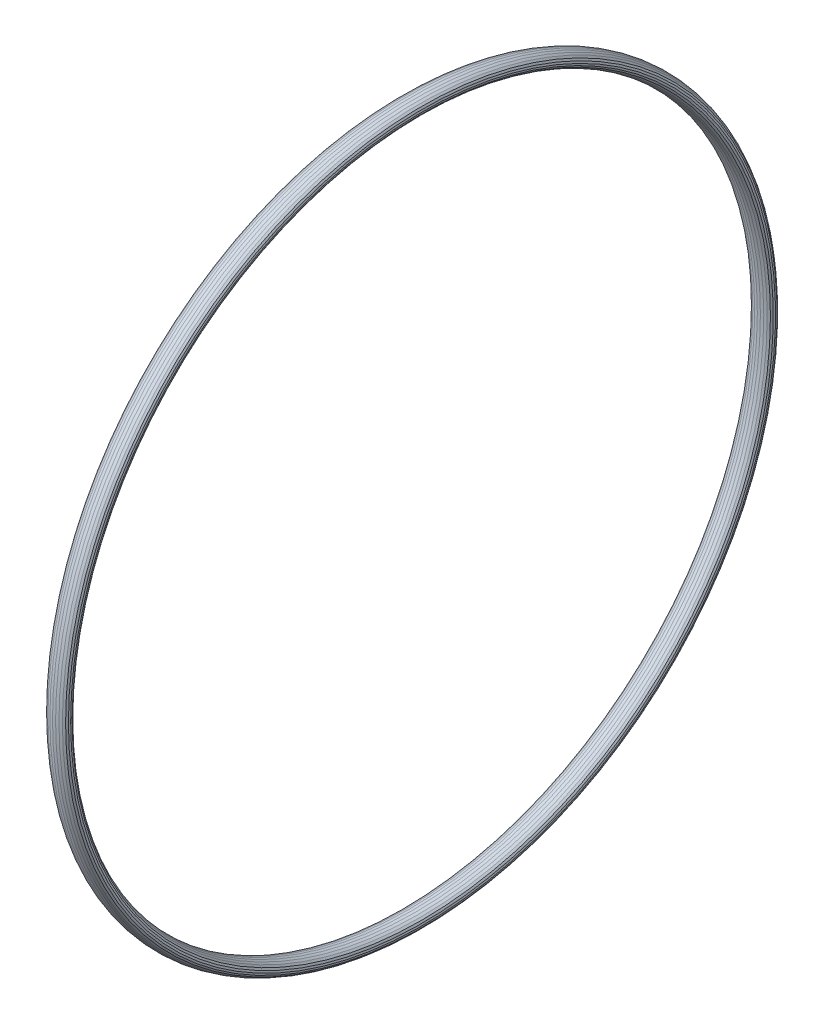
ISO-10303-21;
HEADER;
FILE_DESCRIPTION(('STEP AP214'),'2;1');
FILE_NAME('part.step','',(''),(''),'','','');
FILE_SCHEMA(('AUTOMOTIVE_DESIGN { 1 0 10303 214 1 1 1 1 }'));
ENDSEC;
DATA;
#1=APPLICATION_CONTEXT('core data for automotive mechanical design processes');
#2=APPLICATION_PROTOCOL_DEFINITION('international standard','automotive_design',2000,#1);
#3=PRODUCT_CONTEXT('',#1,'mechanical');
#4=PRODUCT('Part','Part','',(#3));
#5=PRODUCT_RELATED_PRODUCT_CATEGORY('part','',(#4));
#6=PRODUCT_DEFINITION_FORMATION('','',#4);
#7=PRODUCT_DEFINITION_CONTEXT('part definition',#1,'design');
#8=PRODUCT_DEFINITION('design','',#6,#7);
#9=PRODUCT_DEFINITION_SHAPE('','',#8);
#10=(LENGTH_UNIT() NAMED_UNIT(*) SI_UNIT(.MILLI.,.METRE.));
#11=(NAMED_UNIT(*) PLANE_ANGLE_UNIT() SI_UNIT($,.RADIAN.));
#12=(NAMED_UNIT(*) SI_UNIT($,.STERADIAN.) SOLID_ANGLE_UNIT());
#13=UNCERTAINTY_MEASURE_WITH_UNIT(LENGTH_MEASURE(1.E-05),#10,'distance_accuracy_value','');
#14=(GEOMETRIC_REPRESENTATION_CONTEXT(3) GLOBAL_UNCERTAINTY_ASSIGNED_CONTEXT((#13)) GLOBAL_UNIT_ASSIGNED_CONTEXT((#10,
#11,#12)) REPRESENTATION_CONTEXT('',''));
#15=CARTESIAN_POINT('',(0.,0.,0.));
#16=DIRECTION('',(0.,0.,1.));
#17=DIRECTION('',(1.,0.,0.));
#18=AXIS2_PLACEMENT_3D('',#15,#16,#17);
#19=CARTESIAN_POINT('',(24.375,0.,0.));
#20=DIRECTION('',(1.,0.,0.));
#21=DIRECTION('',(0.,0.,-1.));
#22=AXIS2_PLACEMENT_3D('',#19,#20,#21);
#23=CONICAL_SURFACE('',#22,71.42,0.0861761715965993);
#24=CARTESIAN_POINT('',(23.8109764528378,0.,0.));
#25=DIRECTION('',(-1.,0.,0.));
#26=DIRECTION('',(0.,0.,1.));
#27=AXIS2_PLACEMENT_3D('',#24,#25,#26);
#28=CIRCLE('',#27,71.3712739315934);
#29=CARTESIAN_POINT('',(23.8109764528378,0.,71.3712739315934));
#30=VERTEX_POINT('',#29);
#31=EDGE_CURVE('E113',#30,#30,#28,.T.);
#32=ORIENTED_EDGE('',*,*,#31,.F.);
#33=EDGE_LOOP('',(#32));
#34=FACE_BOUND('',#33,.T.);
#35=CARTESIAN_POINT('',(24.375,0.,0.));
#36=DIRECTION('',(-1.,0.,0.));
#37=DIRECTION('',(0.,0.,1.));
#38=AXIS2_PLACEMENT_3D('',#35,#36,#37);
#39=CIRCLE('',#38,71.42);
#40=CARTESIAN_POINT('',(24.375,0.,71.42));
#41=VERTEX_POINT('',#40);
#42=EDGE_CURVE('E10',#41,#41,#39,.T.);
#43=ORIENTED_EDGE('',*,*,#42,.T.);
#44=EDGE_LOOP('',(#43));
#45=FACE_BOUND('',#44,.T.);
#46=ADVANCED_FACE('F39',(#34,#45),#23,.T.);
#47=CARTESIAN_POINT('',(24.9390235471623,0.,0.));
#48=DIRECTION('',(-1.,0.,0.));
#49=DIRECTION('',(0.,0.,1.));
#50=AXIS2_PLACEMENT_3D('',#47,#48,#49);
#51=CONICAL_SURFACE('',#50,71.3712739315934,0.0861761715965993);
#52=ORIENTED_EDGE('',*,*,#42,.F.);
#53=EDGE_LOOP('',(#52));
#54=FACE_BOUND('',#53,.T.);
#55=CARTESIAN_POINT('',(24.9390235471623,0.,0.));
#56=DIRECTION('',(-1.,0.,0.));
#57=DIRECTION('',(0.,0.,1.));
#58=AXIS2_PLACEMENT_3D('',#55,#56,#57);
#59=CIRCLE('',#58,71.3712739315934);
#60=CARTESIAN_POINT('',(24.9390235471623,0.,71.3712739315934));
#61=VERTEX_POINT('',#60);
#62=EDGE_CURVE('E44',#61,#61,#59,.T.);
#63=ORIENTED_EDGE('',*,*,#62,.T.);
#64=EDGE_LOOP('',(#63));
#65=FACE_BOUND('',#64,.T.);
#66=ADVANCED_FACE('F125',(#54,#65),#51,.T.);
#67=CARTESIAN_POINT('',(25.4646098216784,0.,0.));
#68=DIRECTION('',(-1.,0.,0.));
#69=DIRECTION('',(0.,0.,1.));
#70=AXIS2_PLACEMENT_3D('',#67,#68,#69);
#71=CONICAL_SURFACE('',#70,71.2284163274117,0.265394535862062);
#72=ORIENTED_EDGE('',*,*,#62,.F.);
#73=EDGE_LOOP('',(#72));
#74=FACE_BOUND('',#73,.T.);
#75=CARTESIAN_POINT('',(25.4646098216784,0.,0.));
#76=DIRECTION('',(-1.,0.,0.));
#77=DIRECTION('',(0.,0.,1.));
#78=AXIS2_PLACEMENT_3D('',#75,#76,#77);
#79=CIRCLE('',#78,71.2284163274117);
#80=CARTESIAN_POINT('',(25.4646098216784,0.,71.2284163274117));
#81=VERTEX_POINT('',#80);
#82=EDGE_CURVE('E47',#81,#81,#79,.T.);
#83=ORIENTED_EDGE('',*,*,#82,.T.);
#84=EDGE_LOOP('',(#83));
#85=FACE_BOUND('',#84,.T.);
#86=ADVANCED_FACE('F127',(#74,#85),#71,.T.);
#87=CARTESIAN_POINT('',(25.9159409875125,0.,0.));
#88=DIRECTION('',(-1.,0.,0.));
#89=DIRECTION('',(0.,0.,1.));
#90=AXIS2_PLACEMENT_3D('',#87,#88,#89);
#91=CONICAL_SURFACE('',#90,71.0011626970968,0.466458514004162);
#92=ORIENTED_EDGE('',*,*,#82,.F.);
#93=EDGE_LOOP('',(#92));
#94=FACE_BOUND('',#93,.T.);
#95=CARTESIAN_POINT('',(25.9159409875125,0.,0.));
#96=DIRECTION('',(-1.,0.,0.));
#97=DIRECTION('',(0.,0.,1.));
#98=AXIS2_PLACEMENT_3D('',#95,#96,#97);
#99=CIRCLE('',#98,71.0011626970968);
#100=CARTESIAN_POINT('',(25.9159409875125,0.,71.0011626970968));
#101=VERTEX_POINT('',#100);
#102=EDGE_CURVE('E52',#101,#101,#99,.T.);
#103=ORIENTED_EDGE('',*,*,#102,.T.);
#104=EDGE_LOOP('',(#103));
#105=FACE_BOUND('',#104,.T.);
#106=ADVANCED_FACE('F132',(#94,#105),#91,.T.);
#107=CARTESIAN_POINT('',(26.2622595715729,0.,0.));
#108=DIRECTION('',(-1.,0.,0.));
#109=DIRECTION('',(0.,0.,1.));
#110=AXIS2_PLACEMENT_3D('',#107,#108,#109);
#111=CONICAL_SURFACE('',#110,70.705,0.707490259676886);
#112=ORIENTED_EDGE('',*,*,#102,.F.);
#113=EDGE_LOOP('',(#112));
#114=FACE_BOUND('',#113,.T.);
#115=CARTESIAN_POINT('',(26.2622595715729,0.,0.));
#116=DIRECTION('',(-1.,0.,0.));
#117=DIRECTION('',(0.,0.,1.));
#118=AXIS2_PLACEMENT_3D('',#115,#116,#117);
#119=CIRCLE('',#118,70.705);
#120=CARTESIAN_POINT('',(26.2622595715729,0.,70.705));
#121=VERTEX_POINT('',#120);
#122=EDGE_CURVE('E59',#121,#121,#119,.T.);
#123=ORIENTED_EDGE('',*,*,#122,.T.);
#124=EDGE_LOOP('',(#123));
#125=FACE_BOUND('',#124,.T.);
#126=ADVANCED_FACE('F140',(#114,#125),#111,.T.);
#127=CARTESIAN_POINT('',(26.4799645346747,0.,0.));
#128=DIRECTION('',(-1.,0.,0.));
#129=DIRECTION('',(0.,0.,1.));
#130=AXIS2_PLACEMENT_3D('',#127,#128,#129);
#131=CONICAL_SURFACE('',#130,70.3601112344966,1.00772783413073);
#132=ORIENTED_EDGE('',*,*,#122,.F.);
#133=EDGE_LOOP('',(#132));
#134=FACE_BOUND('',#133,.T.);
#135=CARTESIAN_POINT('',(26.4799645346747,0.,0.));
#136=DIRECTION('',(-1.,0.,0.));
#137=DIRECTION('',(0.,0.,1.));
#138=AXIS2_PLACEMENT_3D('',#135,#136,#137);
#139=CIRCLE('',#138,70.3601112344966);
#140=CARTESIAN_POINT('',(26.4799645346747,0.,70.3601112344966));
#141=VERTEX_POINT('',#140);
#142=EDGE_CURVE('E62',#141,#141,#139,.T.);
#143=ORIENTED_EDGE('',*,*,#142,.T.);
#144=EDGE_LOOP('',(#143));
#145=FACE_BOUND('',#144,.T.);
#146=ADVANCED_FACE('F143',(#134,#145),#131,.T.);
#147=CARTESIAN_POINT('',(26.5542196433566,0.,0.));
#148=DIRECTION('',(-1.,0.,0.));
#149=DIRECTION('',(0.,0.,1.));
#150=AXIS2_PLACEMENT_3D('',#147,#148,#149);
#151=CONICAL_SURFACE('',#150,69.99,1.37279587191863);
#152=ORIENTED_EDGE('',*,*,#142,.F.);
#153=EDGE_LOOP('',(#152));
#154=FACE_BOUND('',#153,.T.);
#155=CARTESIAN_POINT('',(26.5542196433566,0.,0.));
#156=DIRECTION('',(-1.,0.,0.));
#157=DIRECTION('',(0.,0.,1.));
#158=AXIS2_PLACEMENT_3D('',#155,#156,#157);
#159=CIRCLE('',#158,69.99);
#160=CARTESIAN_POINT('',(26.5542196433566,0.,69.99));
#161=VERTEX_POINT('',#160);
#162=EDGE_CURVE('E61',#161,#161,#159,.T.);
#163=ORIENTED_EDGE('',*,*,#162,.T.);
#164=EDGE_LOOP('',(#163));
#165=FACE_BOUND('',#164,.T.);
#166=ADVANCED_FACE('F144',(#154,#165),#151,.T.);
#167=CARTESIAN_POINT('',(26.4799645346747,0.,0.));
#168=DIRECTION('',(1.,0.,0.));
#169=DIRECTION('',(0.,0.,-1.));
#170=AXIS2_PLACEMENT_3D('',#167,#168,#169);
#171=CONICAL_SURFACE('',#170,69.6198887655034,1.37279587191863);
#172=ORIENTED_EDGE('',*,*,#162,.F.);
#173=EDGE_LOOP('',(#172));
#174=FACE_BOUND('',#173,.T.);
#175=CARTESIAN_POINT('',(26.4799645346747,0.,0.));
#176=DIRECTION('',(-1.,0.,0.));
#177=DIRECTION('',(0.,0.,1.));
#178=AXIS2_PLACEMENT_3D('',#175,#176,#177);
#179=CIRCLE('',#178,69.6198887655034);
#180=CARTESIAN_POINT('',(26.4799645346747,0.,69.6198887655034));
#181=VERTEX_POINT('',#180);
#182=EDGE_CURVE('E70',#181,#181,#179,.T.);
#183=ORIENTED_EDGE('',*,*,#182,.T.);
#184=EDGE_LOOP('',(#183));
#185=FACE_BOUND('',#184,.T.);
#186=ADVANCED_FACE('F149',(#174,#185),#171,.F.);
#187=CARTESIAN_POINT('',(26.2622595715729,0.,0.));
#188=DIRECTION('',(1.,0.,0.));
#189=DIRECTION('',(0.,0.,-1.));
#190=AXIS2_PLACEMENT_3D('',#187,#188,#189);
#191=CONICAL_SURFACE('',#190,69.275,1.00772783413073);
#192=ORIENTED_EDGE('',*,*,#182,.F.);
#193=EDGE_LOOP('',(#192));
#194=FACE_BOUND('',#193,.T.);
#195=CARTESIAN_POINT('',(26.2622595715729,0.,0.));
#196=DIRECTION('',(-1.,0.,0.));
#197=DIRECTION('',(0.,0.,1.));
#198=AXIS2_PLACEMENT_3D('',#195,#196,#197);
#199=CIRCLE('',#198,69.275);
#200=CARTESIAN_POINT('',(26.2622595715729,0.,69.275));
#201=VERTEX_POINT('',#200);
#202=EDGE_CURVE('E68',#201,#201,#199,.T.);
#203=ORIENTED_EDGE('',*,*,#202,.T.);
#204=EDGE_LOOP('',(#203));
#205=FACE_BOUND('',#204,.T.);
#206=ADVANCED_FACE('F153',(#194,#205),#191,.F.);
#207=CARTESIAN_POINT('',(25.9159409875125,0.,0.));
#208=DIRECTION('',(1.,0.,0.));
#209=DIRECTION('',(0.,0.,-1.));
#210=AXIS2_PLACEMENT_3D('',#207,#208,#209);
#211=CONICAL_SURFACE('',#210,68.9788373029032,0.707490259676886);
#212=ORIENTED_EDGE('',*,*,#202,.F.);
#213=EDGE_LOOP('',(#212));
#214=FACE_BOUND('',#213,.T.);
#215=CARTESIAN_POINT('',(25.9159409875125,0.,0.));
#216=DIRECTION('',(-1.,0.,0.));
#217=DIRECTION('',(0.,0.,1.));
#218=AXIS2_PLACEMENT_3D('',#215,#216,#217);
#219=CIRCLE('',#218,68.9788373029032);
#220=CARTESIAN_POINT('',(25.9159409875125,0.,68.9788373029032));
#221=VERTEX_POINT('',#220);
#222=EDGE_CURVE('E71',#221,#221,#219,.T.);
#223=ORIENTED_EDGE('',*,*,#222,.T.);
#224=EDGE_LOOP('',(#223));
#225=FACE_BOUND('',#224,.T.);
#226=ADVANCED_FACE('F160',(#214,#225),#211,.F.);
#227=CARTESIAN_POINT('',(25.4646098216784,0.,0.));
#228=DIRECTION('',(1.,0.,0.));
#229=DIRECTION('',(0.,0.,-1.));
#230=AXIS2_PLACEMENT_3D('',#227,#228,#229);
#231=CONICAL_SURFACE('',#230,68.7515836725883,0.466458514004162);
#232=ORIENTED_EDGE('',*,*,#222,.F.);
#233=EDGE_LOOP('',(#232));
#234=FACE_BOUND('',#233,.T.);
#235=CARTESIAN_POINT('',(25.4646098216784,0.,0.));
#236=DIRECTION('',(-1.,0.,0.));
#237=DIRECTION('',(0.,0.,1.));
#238=AXIS2_PLACEMENT_3D('',#235,#236,#237);
#239=CIRCLE('',#238,68.7515836725883);
#240=CARTESIAN_POINT('',(25.4646098216784,0.,68.7515836725883));
#241=VERTEX_POINT('',#240);
#242=EDGE_CURVE('E77',#241,#241,#239,.T.);
#243=ORIENTED_EDGE('',*,*,#242,.T.);
#244=EDGE_LOOP('',(#243));
#245=FACE_BOUND('',#244,.T.);
#246=ADVANCED_FACE('F161',(#234,#245),#231,.F.);
#247=CARTESIAN_POINT('',(24.9390235471623,0.,0.));
#248=DIRECTION('',(1.,0.,0.));
#249=DIRECTION('',(0.,0.,-1.));
#250=AXIS2_PLACEMENT_3D('',#247,#248,#249);
#251=CONICAL_SURFACE('',#250,68.6087260684066,0.265394535862062);
#252=ORIENTED_EDGE('',*,*,#242,.F.);
#253=EDGE_LOOP('',(#252));
#254=FACE_BOUND('',#253,.T.);
#255=CARTESIAN_POINT('',(24.9390235471623,0.,0.));
#256=DIRECTION('',(-1.,0.,0.));
#257=DIRECTION('',(0.,0.,1.));
#258=AXIS2_PLACEMENT_3D('',#255,#256,#257);
#259=CIRCLE('',#258,68.6087260684066);
#260=CARTESIAN_POINT('',(24.9390235471623,0.,68.6087260684066));
#261=VERTEX_POINT('',#260);
#262=EDGE_CURVE('E76',#261,#261,#259,.T.);
#263=ORIENTED_EDGE('',*,*,#262,.T.);
#264=EDGE_LOOP('',(#263));
#265=FACE_BOUND('',#264,.T.);
#266=ADVANCED_FACE('F164',(#254,#265),#251,.F.);
#267=CARTESIAN_POINT('',(24.375,0.,0.));
#268=DIRECTION('',(1.,0.,0.));
#269=DIRECTION('',(0.,0.,-1.));
#270=AXIS2_PLACEMENT_3D('',#267,#268,#269);
#271=CONICAL_SURFACE('',#270,68.56,0.0861761715966237);
#272=ORIENTED_EDGE('',*,*,#262,.F.);
#273=EDGE_LOOP('',(#272));
#274=FACE_BOUND('',#273,.T.);
#275=CARTESIAN_POINT('',(24.375,0.,0.));
#276=DIRECTION('',(-1.,0.,0.));
#277=DIRECTION('',(0.,0.,1.));
#278=AXIS2_PLACEMENT_3D('',#275,#276,#277);
#279=CIRCLE('',#278,68.56);
#280=CARTESIAN_POINT('',(24.375,0.,68.56));
#281=VERTEX_POINT('',#280);
#282=EDGE_CURVE('E85',#281,#281,#279,.T.);
#283=ORIENTED_EDGE('',*,*,#282,.T.);
#284=EDGE_LOOP('',(#283));
#285=FACE_BOUND('',#284,.T.);
#286=ADVANCED_FACE('F166',(#274,#285),#271,.F.);
#287=CARTESIAN_POINT('',(23.8109764528378,0.,0.));
#288=DIRECTION('',(-1.,0.,0.));
#289=DIRECTION('',(0.,0.,1.));
#290=AXIS2_PLACEMENT_3D('',#287,#288,#289);
#291=CONICAL_SURFACE('',#290,68.6087260684066,0.0861761715966237);
#292=ORIENTED_EDGE('',*,*,#282,.F.);
#293=EDGE_LOOP('',(#292));
#294=FACE_BOUND('',#293,.T.);
#295=CARTESIAN_POINT('',(23.8109764528378,0.,0.));
#296=DIRECTION('',(-1.,0.,0.));
#297=DIRECTION('',(0.,0.,1.));
#298=AXIS2_PLACEMENT_3D('',#295,#296,#297);
#299=CIRCLE('',#298,68.6087260684066);
#300=CARTESIAN_POINT('',(23.8109764528378,0.,68.6087260684066));
#301=VERTEX_POINT('',#300);
#302=EDGE_CURVE('E83',#301,#301,#299,.T.);
#303=ORIENTED_EDGE('',*,*,#302,.T.);
#304=EDGE_LOOP('',(#303));
#305=FACE_BOUND('',#304,.T.);
#306=ADVANCED_FACE('F174',(#294,#305),#291,.F.);
#307=CARTESIAN_POINT('',(23.2853901783217,0.,0.));
#308=DIRECTION('',(-1.,0.,0.));
#309=DIRECTION('',(0.,0.,1.));
#310=AXIS2_PLACEMENT_3D('',#307,#308,#309);
#311=CONICAL_SURFACE('',#310,68.7515836725883,0.265394535862062);
#312=ORIENTED_EDGE('',*,*,#302,.F.);
#313=EDGE_LOOP('',(#312));
#314=FACE_BOUND('',#313,.T.);
#315=CARTESIAN_POINT('',(23.2853901783217,0.,0.));
#316=DIRECTION('',(-1.,0.,0.));
#317=DIRECTION('',(0.,0.,1.));
#318=AXIS2_PLACEMENT_3D('',#315,#316,#317);
#319=CIRCLE('',#318,68.7515836725883);
#320=CARTESIAN_POINT('',(23.2853901783217,0.,68.7515836725883));
#321=VERTEX_POINT('',#320);
#322=EDGE_CURVE('E86',#321,#321,#319,.T.);
#323=ORIENTED_EDGE('',*,*,#322,.T.);
#324=EDGE_LOOP('',(#323));
#325=FACE_BOUND('',#324,.T.);
#326=ADVANCED_FACE('F180',(#314,#325),#311,.F.);
#327=CARTESIAN_POINT('',(22.8340590124876,0.,0.));
#328=DIRECTION('',(-1.,0.,0.));
#329=DIRECTION('',(0.,0.,1.));
#330=AXIS2_PLACEMENT_3D('',#327,#328,#329);
#331=CONICAL_SURFACE('',#330,68.9788373029032,0.466458514004162);
#332=ORIENTED_EDGE('',*,*,#322,.F.);
#333=EDGE_LOOP('',(#332));
#334=FACE_BOUND('',#333,.T.);
#335=CARTESIAN_POINT('',(22.8340590124876,0.,0.));
#336=DIRECTION('',(-1.,0.,0.));
#337=DIRECTION('',(0.,0.,1.));
#338=AXIS2_PLACEMENT_3D('',#335,#336,#337);
#339=CIRCLE('',#338,68.9788373029032);
#340=CARTESIAN_POINT('',(22.8340590124876,0.,68.9788373029032));
#341=VERTEX_POINT('',#340);
#342=EDGE_CURVE('E93',#341,#341,#339,.T.);
#343=ORIENTED_EDGE('',*,*,#342,.T.);
#344=EDGE_LOOP('',(#343));
#345=FACE_BOUND('',#344,.T.);
#346=ADVANCED_FACE('F182',(#334,#345),#331,.F.);
#347=CARTESIAN_POINT('',(22.4877404284272,0.,0.));
#348=DIRECTION('',(-1.,0.,0.));
#349=DIRECTION('',(0.,0.,1.));
#350=AXIS2_PLACEMENT_3D('',#347,#348,#349);
#351=CONICAL_SURFACE('',#350,69.275,0.707490259676886);
#352=ORIENTED_EDGE('',*,*,#342,.F.);
#353=EDGE_LOOP('',(#352));
#354=FACE_BOUND('',#353,.T.);
#355=CARTESIAN_POINT('',(22.4877404284272,0.,0.));
#356=DIRECTION('',(-1.,0.,0.));
#357=DIRECTION('',(0.,0.,1.));
#358=AXIS2_PLACEMENT_3D('',#355,#356,#357);
#359=CIRCLE('',#358,69.275);
#360=CARTESIAN_POINT('',(22.4877404284272,0.,69.275));
#361=VERTEX_POINT('',#360);
#362=EDGE_CURVE('E94',#361,#361,#359,.T.);
#363=ORIENTED_EDGE('',*,*,#362,.T.);
#364=EDGE_LOOP('',(#363));
#365=FACE_BOUND('',#364,.T.);
#366=ADVANCED_FACE('F183',(#354,#365),#351,.F.);
#367=CARTESIAN_POINT('',(22.2700354653254,0.,0.));
#368=DIRECTION('',(-1.,0.,0.));
#369=DIRECTION('',(0.,0.,1.));
#370=AXIS2_PLACEMENT_3D('',#367,#368,#369);
#371=CONICAL_SURFACE('',#370,69.6198887655034,1.00772783413073);
#372=ORIENTED_EDGE('',*,*,#362,.F.);
#373=EDGE_LOOP('',(#372));
#374=FACE_BOUND('',#373,.T.);
#375=CARTESIAN_POINT('',(22.2700354653254,0.,0.));
#376=DIRECTION('',(-1.,0.,0.));
#377=DIRECTION('',(0.,0.,1.));
#378=AXIS2_PLACEMENT_3D('',#375,#376,#377);
#379=CIRCLE('',#378,69.6198887655034);
#380=CARTESIAN_POINT('',(22.2700354653254,0.,69.6198887655034));
#381=VERTEX_POINT('',#380);
#382=EDGE_CURVE('E100',#381,#381,#379,.T.);
#383=ORIENTED_EDGE('',*,*,#382,.T.);
#384=EDGE_LOOP('',(#383));
#385=FACE_BOUND('',#384,.T.);
#386=ADVANCED_FACE('F186',(#374,#385),#371,.F.);
#387=CARTESIAN_POINT('',(22.1957803566433,0.,0.));
#388=DIRECTION('',(-1.,0.,0.));
#389=DIRECTION('',(0.,0.,1.));
#390=AXIS2_PLACEMENT_3D('',#387,#388,#389);
#391=CONICAL_SURFACE('',#390,69.99,1.37279587191805);
#392=ORIENTED_EDGE('',*,*,#382,.F.);
#393=EDGE_LOOP('',(#392));
#394=FACE_BOUND('',#393,.T.);
#395=CARTESIAN_POINT('',(22.1957803566433,0.,0.));
#396=DIRECTION('',(-1.,0.,0.));
#397=DIRECTION('',(0.,0.,1.));
#398=AXIS2_PLACEMENT_3D('',#395,#396,#397);
#399=CIRCLE('',#398,69.99);
#400=CARTESIAN_POINT('',(22.1957803566433,0.,69.99));
#401=VERTEX_POINT('',#400);
#402=EDGE_CURVE('E99',#401,#401,#399,.T.);
#403=ORIENTED_EDGE('',*,*,#402,.T.);
#404=EDGE_LOOP('',(#403));
#405=FACE_BOUND('',#404,.T.);
#406=ADVANCED_FACE('F194',(#394,#405),#391,.F.);
#407=CARTESIAN_POINT('',(22.2700354653254,0.,0.));
#408=DIRECTION('',(1.,0.,0.));
#409=DIRECTION('',(0.,0.,-1.));
#410=AXIS2_PLACEMENT_3D('',#407,#408,#409);
#411=CONICAL_SURFACE('',#410,70.3601112344966,1.37279587191805);
#412=ORIENTED_EDGE('',*,*,#402,.F.);
#413=EDGE_LOOP('',(#412));
#414=FACE_BOUND('',#413,.T.);
#415=CARTESIAN_POINT('',(22.2700354653254,0.,0.));
#416=DIRECTION('',(-1.,0.,0.));
#417=DIRECTION('',(0.,0.,1.));
#418=AXIS2_PLACEMENT_3D('',#415,#416,#417);
#419=CIRCLE('',#418,70.3601112344966);
#420=CARTESIAN_POINT('',(22.2700354653254,0.,70.3601112344966));
#421=VERTEX_POINT('',#420);
#422=EDGE_CURVE('E103',#421,#421,#419,.T.);
#423=ORIENTED_EDGE('',*,*,#422,.T.);
#424=EDGE_LOOP('',(#423));
#425=FACE_BOUND('',#424,.T.);
#426=ADVANCED_FACE('F197',(#414,#425),#411,.T.);
#427=CARTESIAN_POINT('',(22.4877404284272,0.,0.));
#428=DIRECTION('',(1.,0.,0.));
#429=DIRECTION('',(0.,0.,-1.));
#430=AXIS2_PLACEMENT_3D('',#427,#428,#429);
#431=CONICAL_SURFACE('',#430,70.705,1.00772783413073);
#432=ORIENTED_EDGE('',*,*,#422,.F.);
#433=EDGE_LOOP('',(#432));
#434=FACE_BOUND('',#433,.T.);
#435=CARTESIAN_POINT('',(22.4877404284272,0.,0.));
#436=DIRECTION('',(-1.,0.,0.));
#437=DIRECTION('',(0.,0.,1.));
#438=AXIS2_PLACEMENT_3D('',#435,#436,#437);
#439=CIRCLE('',#438,70.705);
#440=CARTESIAN_POINT('',(22.4877404284272,0.,70.705));
#441=VERTEX_POINT('',#440);
#442=EDGE_CURVE('E106',#441,#441,#439,.T.);
#443=ORIENTED_EDGE('',*,*,#442,.T.);
#444=EDGE_LOOP('',(#443));
#445=FACE_BOUND('',#444,.T.);
#446=ADVANCED_FACE('F203',(#434,#445),#431,.T.);
#447=CARTESIAN_POINT('',(22.8340590124876,0.,0.));
#448=DIRECTION('',(1.,0.,0.));
#449=DIRECTION('',(0.,0.,-1.));
#450=AXIS2_PLACEMENT_3D('',#447,#448,#449);
#451=CONICAL_SURFACE('',#450,71.0011626970968,0.707490259676886);
#452=ORIENTED_EDGE('',*,*,#442,.F.);
#453=EDGE_LOOP('',(#452));
#454=FACE_BOUND('',#453,.T.);
#455=CARTESIAN_POINT('',(22.8340590124876,0.,0.));
#456=DIRECTION('',(-1.,0.,0.));
#457=DIRECTION('',(0.,0.,1.));
#458=AXIS2_PLACEMENT_3D('',#455,#456,#457);
#459=CIRCLE('',#458,71.0011626970968);
#460=CARTESIAN_POINT('',(22.8340590124876,0.,71.0011626970968));
#461=VERTEX_POINT('',#460);
#462=EDGE_CURVE('E108',#461,#461,#459,.T.);
#463=ORIENTED_EDGE('',*,*,#462,.T.);
#464=EDGE_LOOP('',(#463));
#465=FACE_BOUND('',#464,.T.);
#466=ADVANCED_FACE('F202',(#454,#465),#451,.T.);
#467=CARTESIAN_POINT('',(23.2853901783217,0.,0.));
#468=DIRECTION('',(1.,0.,0.));
#469=DIRECTION('',(0.,0.,-1.));
#470=AXIS2_PLACEMENT_3D('',#467,#468,#469);
#471=CONICAL_SURFACE('',#470,71.2284163274117,0.466458514004162);
#472=ORIENTED_EDGE('',*,*,#462,.F.);
#473=EDGE_LOOP('',(#472));
#474=FACE_BOUND('',#473,.T.);
#475=CARTESIAN_POINT('',(23.2853901783217,0.,0.));
#476=DIRECTION('',(-1.,0.,0.));
#477=DIRECTION('',(0.,0.,1.));
#478=AXIS2_PLACEMENT_3D('',#475,#476,#477);
#479=CIRCLE('',#478,71.2284163274117);
#480=CARTESIAN_POINT('',(23.2853901783217,0.,71.2284163274117));
#481=VERTEX_POINT('',#480);
#482=EDGE_CURVE('E115',#481,#481,#479,.T.);
#483=ORIENTED_EDGE('',*,*,#482,.T.);
#484=EDGE_LOOP('',(#483));
#485=FACE_BOUND('',#484,.T.);
#486=ADVANCED_FACE('F207',(#474,#485),#471,.T.);
#487=CARTESIAN_POINT('',(23.8109764528378,0.,0.));
#488=DIRECTION('',(1.,0.,0.));
#489=DIRECTION('',(0.,0.,-1.));
#490=AXIS2_PLACEMENT_3D('',#487,#488,#489);
#491=CONICAL_SURFACE('',#490,71.3712739315934,0.265394535862062);
#492=ORIENTED_EDGE('',*,*,#482,.F.);
#493=EDGE_LOOP('',(#492));
#494=FACE_BOUND('',#493,.T.);
#495=ORIENTED_EDGE('',*,*,#31,.T.);
#496=EDGE_LOOP('',(#495));
#497=FACE_BOUND('',#496,.T.);
#498=ADVANCED_FACE('F116',(#494,#497),#491,.T.);
#499=CLOSED_SHELL('',(#46,#66,#86,#106,#126,#146,#166,#186,#206,#226,#246,#266,#286,#306,#326,
#346,#366,#386,#406,#426,#446,#466,#486,#498));
#500=MANIFOLD_SOLID_BREP('B2',#499);
#501=ADVANCED_BREP_SHAPE_REPRESENTATION('',(#18,#500),#14);
#502=SHAPE_DEFINITION_REPRESENTATION(#9,#501);
ENDSEC;
END-ISO-10303-21;
